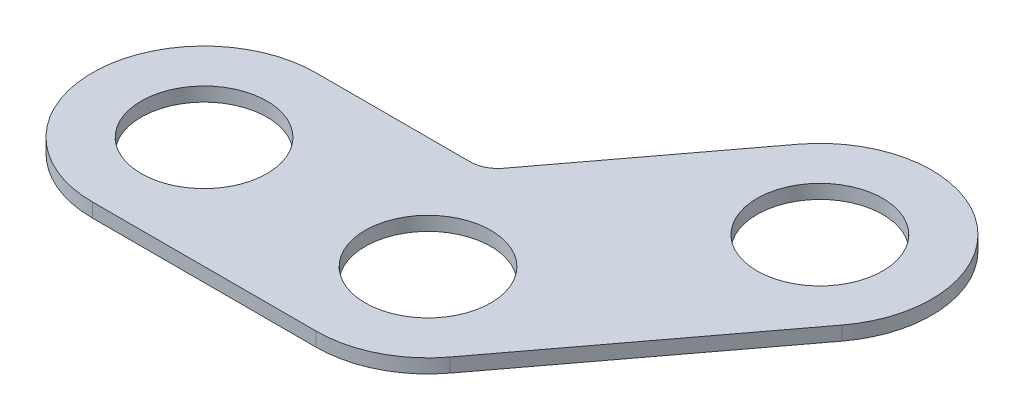
ISO-10303-21;
HEADER;
FILE_DESCRIPTION(('STEP AP214'),'2;1');
FILE_NAME('part.step','',(''),(''),'','','');
FILE_SCHEMA(('AUTOMOTIVE_DESIGN { 1 0 10303 214 1 1 1 1 }'));
ENDSEC;
DATA;
#1=APPLICATION_CONTEXT('core data for automotive mechanical design processes');
#2=APPLICATION_PROTOCOL_DEFINITION('international standard','automotive_design',2000,#1);
#3=PRODUCT_CONTEXT('',#1,'mechanical');
#4=PRODUCT('Part','Part','',(#3));
#5=PRODUCT_RELATED_PRODUCT_CATEGORY('part','',(#4));
#6=PRODUCT_DEFINITION_FORMATION('','',#4);
#7=PRODUCT_DEFINITION_CONTEXT('part definition',#1,'design');
#8=PRODUCT_DEFINITION('design','',#6,#7);
#9=PRODUCT_DEFINITION_SHAPE('','',#8);
#10=(LENGTH_UNIT() NAMED_UNIT(*) SI_UNIT(.MILLI.,.METRE.));
#11=(NAMED_UNIT(*) PLANE_ANGLE_UNIT() SI_UNIT($,.RADIAN.));
#12=(NAMED_UNIT(*) SI_UNIT($,.STERADIAN.) SOLID_ANGLE_UNIT());
#13=UNCERTAINTY_MEASURE_WITH_UNIT(LENGTH_MEASURE(1.E-05),#10,'distance_accuracy_value','');
#14=(GEOMETRIC_REPRESENTATION_CONTEXT(3) GLOBAL_UNCERTAINTY_ASSIGNED_CONTEXT((#13)) GLOBAL_UNIT_ASSIGNED_CONTEXT((#10,
#11,#12)) REPRESENTATION_CONTEXT('',''));
#15=CARTESIAN_POINT('',(0.,0.,0.));
#16=DIRECTION('',(0.,0.,1.));
#17=DIRECTION('',(1.,0.,0.));
#18=AXIS2_PLACEMENT_3D('',#15,#16,#17);
#19=CARTESIAN_POINT('',(52.7799348679045,3.175,39.7147931715671));
#20=DIRECTION('',(-0.799055461536221,0.,-0.601257323771724));
#21=DIRECTION('',(-0.601257323771724,0.,0.799055461536221));
#22=AXIS2_PLACEMENT_3D('',#19,#20,#21);
#23=PLANE('',#22);
#24=DIRECTION('',(0.601257323771724,0.,-0.799055461536221));
#25=VECTOR('',#24,1.);
#26=CARTESIAN_POINT('',(52.7799348679045,0.,39.7147931715671));
#27=LINE('',#26,#25);
#28=CARTESIAN_POINT('',(71.17220872302,0.,15.2719360238018));
#29=VERTEX_POINT('',#28);
#30=CARTESIAN_POINT('',(109.397864590596,0.,-35.5289738099173));
#31=VERTEX_POINT('',#30);
#32=EDGE_CURVE('E132',#29,#31,#27,.T.);
#33=ORIENTED_EDGE('',*,*,#32,.T.);
#34=DIRECTION('',(0.,-1.,0.));
#35=VECTOR('',#34,1.);
#36=CARTESIAN_POINT('',(109.397864590596,3.175,-35.5289738099173));
#37=LINE('',#36,#35);
#38=CARTESIAN_POINT('',(109.397864590596,3.175,-35.5289738099173));
#39=VERTEX_POINT('',#38);
#40=EDGE_CURVE('E112',#39,#31,#37,.T.);
#41=ORIENTED_EDGE('',*,*,#40,.F.);
#42=DIRECTION('',(0.601257323771724,0.,-0.799055461536221));
#43=VECTOR('',#42,1.);
#44=CARTESIAN_POINT('',(52.7799348679045,3.175,39.7147931715671));
#45=LINE('',#44,#43);
#46=CARTESIAN_POINT('',(71.17220872302,3.175,15.2719360238018));
#47=VERTEX_POINT('',#46);
#48=EDGE_CURVE('E119',#47,#39,#45,.T.);
#49=ORIENTED_EDGE('',*,*,#48,.F.);
#50=DIRECTION('',(0.,-1.,0.));
#51=VECTOR('',#50,1.);
#52=CARTESIAN_POINT('',(71.17220872302,3.175,15.2719360238018));
#53=LINE('',#52,#51);
#54=EDGE_CURVE('E156',#47,#29,#53,.T.);
#55=ORIENTED_EDGE('',*,*,#54,.T.);
#56=EDGE_LOOP('',(#33,#41,#49,#55));
#57=FACE_BOUND('',#56,.T.);
#58=ADVANCED_FACE('F42',(#57),#23,.F.);
#59=CARTESIAN_POINT('',(89.1018558675759,3.175,-50.8009098337191));
#60=DIRECTION('',(0.,-1.,0.));
#61=DIRECTION('',(0.,0.,-1.));
#62=AXIS2_PLACEMENT_3D('',#59,#60,#61);
#63=CYLINDRICAL_SURFACE('',#62,25.4);
#64=CARTESIAN_POINT('',(89.1018558675759,0.,-50.8009098337191));
#65=DIRECTION('',(0.,1.,0.));
#66=DIRECTION('',(0.,0.,1.));
#67=AXIS2_PLACEMENT_3D('',#64,#65,#66);
#68=CIRCLE('',#67,25.4);
#69=CARTESIAN_POINT('',(68.8058471445559,0.,-66.0728458575209));
#70=VERTEX_POINT('',#69);
#71=EDGE_CURVE('E175',#31,#70,#68,.T.);
#72=ORIENTED_EDGE('',*,*,#71,.T.);
#73=DIRECTION('',(0.,-1.,0.));
#74=VECTOR('',#73,1.);
#75=CARTESIAN_POINT('',(68.8058471445559,3.175,-66.0728458575209));
#76=LINE('',#75,#74);
#77=CARTESIAN_POINT('',(68.8058471445559,3.175,-66.0728458575209));
#78=VERTEX_POINT('',#77);
#79=EDGE_CURVE('E115',#78,#70,#76,.T.);
#80=ORIENTED_EDGE('',*,*,#79,.F.);
#81=CARTESIAN_POINT('',(89.1018558675759,3.175,-50.8009098337191));
#82=DIRECTION('',(0.,1.,0.));
#83=DIRECTION('',(0.,0.,1.));
#84=AXIS2_PLACEMENT_3D('',#81,#82,#83);
#85=CIRCLE('',#84,25.4);
#86=EDGE_CURVE('E107',#39,#78,#85,.T.);
#87=ORIENTED_EDGE('',*,*,#86,.F.);
#88=ORIENTED_EDGE('',*,*,#40,.T.);
#89=EDGE_LOOP('',(#72,#80,#87,#88));
#90=FACE_BOUND('',#89,.T.);
#91=ADVANCED_FACE('F110',(#90),#63,.T.);
#92=CARTESIAN_POINT('',(12.1879174218644,3.175,9.17092112396354));
#93=DIRECTION('',(-0.799055461536222,0.,-0.601257323771724));
#94=DIRECTION('',(-0.601257323771724,0.,0.799055461536222));
#95=AXIS2_PLACEMENT_3D('',#92,#93,#94);
#96=PLANE('',#95);
#97=DIRECTION('',(0.601257323771724,0.,-0.799055461536222));
#98=VECTOR('',#97,1.);
#99=CARTESIAN_POINT('',(12.1879174218644,0.,9.17092112396354));
#100=LINE('',#99,#98);
#101=CARTESIAN_POINT('',(40.1063958623448,0.,-27.9320159940496));
#102=VERTEX_POINT('',#101);
#103=EDGE_CURVE('E172',#102,#70,#100,.T.);
#104=ORIENTED_EDGE('',*,*,#103,.F.);
#105=DIRECTION('',(0.,-1.,0.));
#106=VECTOR('',#105,1.);
#107=CARTESIAN_POINT('',(40.1063958623448,3.175,-27.9320159940496));
#108=LINE('',#107,#106);
#109=CARTESIAN_POINT('',(40.1063958623448,3.175,-27.9320159940496));
#110=VERTEX_POINT('',#109);
#111=EDGE_CURVE('E58',#102,#110,#108,.F.);
#112=ORIENTED_EDGE('',*,*,#111,.T.);
#113=DIRECTION('',(0.601257323771724,0.,-0.799055461536222));
#114=VECTOR('',#113,1.);
#115=CARTESIAN_POINT('',(12.1879174218644,3.175,9.17092112396354));
#116=LINE('',#115,#114);
#117=EDGE_CURVE('E118',#110,#78,#116,.T.);
#118=ORIENTED_EDGE('',*,*,#117,.T.);
#119=ORIENTED_EDGE('',*,*,#79,.T.);
#120=EDGE_LOOP('',(#104,#112,#118,#119));
#121=FACE_BOUND('',#120,.T.);
#122=ADVANCED_FACE('F242',(#121),#96,.T.);
#123=CARTESIAN_POINT('',(0.,3.175,-25.4));
#124=DIRECTION('',(0.,0.,-1.));
#125=DIRECTION('',(-1.,0.,0.));
#126=AXIS2_PLACEMENT_3D('',#123,#124,#125);
#127=PLANE('',#126);
#128=DIRECTION('',(1.,0.,0.));
#129=VECTOR('',#128,1.);
#130=CARTESIAN_POINT('',(0.,3.175,-25.4));
#131=LINE('',#130,#129);
#132=CARTESIAN_POINT('',(0.,3.175,-25.4));
#133=VERTEX_POINT('',#132);
#134=CARTESIAN_POINT('',(35.0323936815898,3.175,-25.4));
#135=VERTEX_POINT('',#134);
#136=EDGE_CURVE('E200',#133,#135,#131,.T.);
#137=ORIENTED_EDGE('',*,*,#136,.T.);
#138=DIRECTION('',(0.,-1.,0.));
#139=VECTOR('',#138,1.);
#140=CARTESIAN_POINT('',(35.0323936815898,0.,-25.4));
#141=LINE('',#140,#139);
#142=CARTESIAN_POINT('',(35.0323936815898,0.,-25.4));
#143=VERTEX_POINT('',#142);
#144=EDGE_CURVE('E134',#135,#143,#141,.T.);
#145=ORIENTED_EDGE('',*,*,#144,.T.);
#146=DIRECTION('',(1.,0.,0.));
#147=VECTOR('',#146,1.);
#148=CARTESIAN_POINT('',(0.,0.,-25.4));
#149=LINE('',#148,#147);
#150=CARTESIAN_POINT('',(0.,0.,-25.4));
#151=VERTEX_POINT('',#150);
#152=EDGE_CURVE('E169',#151,#143,#149,.T.);
#153=ORIENTED_EDGE('',*,*,#152,.F.);
#154=DIRECTION('',(0.,-1.,0.));
#155=VECTOR('',#154,1.);
#156=CARTESIAN_POINT('',(0.,3.175,-25.4));
#157=LINE('',#156,#155);
#158=EDGE_CURVE('E140',#133,#151,#157,.T.);
#159=ORIENTED_EDGE('',*,*,#158,.F.);
#160=EDGE_LOOP('',(#137,#145,#153,#159));
#161=FACE_BOUND('',#160,.T.);
#162=ADVANCED_FACE('F249',(#161),#127,.T.);
#163=CARTESIAN_POINT('',(0.,3.175,0.));
#164=DIRECTION('',(0.,-1.,0.));
#165=DIRECTION('',(0.,0.,-1.));
#166=AXIS2_PLACEMENT_3D('',#163,#164,#165);
#167=CYLINDRICAL_SURFACE('',#166,25.4);
#168=CARTESIAN_POINT('',(0.,0.,0.));
#169=DIRECTION('',(0.,1.,0.));
#170=DIRECTION('',(0.,0.,1.));
#171=AXIS2_PLACEMENT_3D('',#168,#169,#170);
#172=CIRCLE('',#171,25.4);
#173=CARTESIAN_POINT('',(0.,0.,25.4));
#174=VERTEX_POINT('',#173);
#175=EDGE_CURVE('E166',#151,#174,#172,.T.);
#176=ORIENTED_EDGE('',*,*,#175,.T.);
#177=DIRECTION('',(0.,-1.,0.));
#178=VECTOR('',#177,1.);
#179=CARTESIAN_POINT('',(0.,3.175,25.4));
#180=LINE('',#179,#178);
#181=CARTESIAN_POINT('',(0.,3.175,25.4));
#182=VERTEX_POINT('',#181);
#183=EDGE_CURVE('E148',#182,#174,#180,.T.);
#184=ORIENTED_EDGE('',*,*,#183,.F.);
#185=CARTESIAN_POINT('',(0.,3.175,0.));
#186=DIRECTION('',(0.,1.,0.));
#187=DIRECTION('',(0.,0.,1.));
#188=AXIS2_PLACEMENT_3D('',#185,#186,#187);
#189=CIRCLE('',#188,25.4);
#190=EDGE_CURVE('E197',#133,#182,#189,.T.);
#191=ORIENTED_EDGE('',*,*,#190,.F.);
#192=ORIENTED_EDGE('',*,*,#158,.T.);
#193=EDGE_LOOP('',(#176,#184,#191,#192));
#194=FACE_BOUND('',#193,.T.);
#195=ADVANCED_FACE('F253',(#194),#167,.T.);
#196=CARTESIAN_POINT('',(0.,3.175,25.4));
#197=DIRECTION('',(0.,0.,-1.));
#198=DIRECTION('',(-1.,0.,0.));
#199=AXIS2_PLACEMENT_3D('',#196,#197,#198);
#200=PLANE('',#199);
#201=DIRECTION('',(1.,0.,0.));
#202=VECTOR('',#201,1.);
#203=CARTESIAN_POINT('',(0.,0.,25.4));
#204=LINE('',#203,#202);
#205=CARTESIAN_POINT('',(50.8762,0.,25.4));
#206=VERTEX_POINT('',#205);
#207=EDGE_CURVE('E163',#174,#206,#204,.T.);
#208=ORIENTED_EDGE('',*,*,#207,.T.);
#209=DIRECTION('',(0.,-1.,0.));
#210=VECTOR('',#209,1.);
#211=CARTESIAN_POINT('',(50.8762,3.175,25.4));
#212=LINE('',#211,#210);
#213=CARTESIAN_POINT('',(50.8762,3.175,25.4));
#214=VERTEX_POINT('',#213);
#215=EDGE_CURVE('E152',#214,#206,#212,.T.);
#216=ORIENTED_EDGE('',*,*,#215,.F.);
#217=DIRECTION('',(1.,0.,0.));
#218=VECTOR('',#217,1.);
#219=CARTESIAN_POINT('',(0.,3.175,25.4));
#220=LINE('',#219,#218);
#221=EDGE_CURVE('E194',#182,#214,#220,.T.);
#222=ORIENTED_EDGE('',*,*,#221,.F.);
#223=ORIENTED_EDGE('',*,*,#183,.T.);
#224=EDGE_LOOP('',(#208,#216,#222,#223));
#225=FACE_BOUND('',#224,.T.);
#226=ADVANCED_FACE('F233',(#225),#200,.F.);
#227=CARTESIAN_POINT('',(0.,3.175,0.));
#228=DIRECTION('',(0.,-1.,0.));
#229=DIRECTION('',(0.,0.,-1.));
#230=AXIS2_PLACEMENT_3D('',#227,#228,#229);
#231=CYLINDRICAL_SURFACE('',#230,14.2875);
#232=CARTESIAN_POINT('',(0.,3.175,0.));
#233=DIRECTION('',(0.,1.,0.));
#234=DIRECTION('',(0.,0.,1.));
#235=AXIS2_PLACEMENT_3D('',#232,#233,#234);
#236=CIRCLE('',#235,14.2875);
#237=CARTESIAN_POINT('',(0.,3.175,14.2875));
#238=VERTEX_POINT('',#237);
#239=EDGE_CURVE('E129',#238,#238,#236,.T.);
#240=ORIENTED_EDGE('',*,*,#239,.T.);
#241=EDGE_LOOP('',(#240));
#242=FACE_BOUND('',#241,.T.);
#243=CARTESIAN_POINT('',(0.,0.,0.));
#244=DIRECTION('',(0.,1.,0.));
#245=DIRECTION('',(0.,0.,1.));
#246=AXIS2_PLACEMENT_3D('',#243,#244,#245);
#247=CIRCLE('',#246,14.2875);
#248=CARTESIAN_POINT('',(0.,0.,14.2875));
#249=VERTEX_POINT('',#248);
#250=EDGE_CURVE('E180',#249,#249,#247,.T.);
#251=ORIENTED_EDGE('',*,*,#250,.F.);
#252=EDGE_LOOP('',(#251));
#253=FACE_BOUND('',#252,.T.);
#254=ADVANCED_FACE('F229',(#242,#253),#231,.F.);
#255=CARTESIAN_POINT('',(50.8762,3.175,0.));
#256=DIRECTION('',(0.,-1.,0.));
#257=DIRECTION('',(0.,0.,-1.));
#258=AXIS2_PLACEMENT_3D('',#255,#256,#257);
#259=CYLINDRICAL_SURFACE('',#258,14.2875);
#260=CARTESIAN_POINT('',(50.8762,3.175,0.));
#261=DIRECTION('',(0.,1.,0.));
#262=DIRECTION('',(0.,0.,1.));
#263=AXIS2_PLACEMENT_3D('',#260,#261,#262);
#264=CIRCLE('',#263,14.2875);
#265=CARTESIAN_POINT('',(50.8762,3.175,14.2875));
#266=VERTEX_POINT('',#265);
#267=EDGE_CURVE('E209',#266,#266,#264,.T.);
#268=ORIENTED_EDGE('',*,*,#267,.T.);
#269=EDGE_LOOP('',(#268));
#270=FACE_BOUND('',#269,.T.);
#271=CARTESIAN_POINT('',(50.8762,0.,0.));
#272=DIRECTION('',(0.,1.,0.));
#273=DIRECTION('',(0.,0.,1.));
#274=AXIS2_PLACEMENT_3D('',#271,#272,#273);
#275=CIRCLE('',#274,14.2875);
#276=CARTESIAN_POINT('',(50.8762,0.,14.2875));
#277=VERTEX_POINT('',#276);
#278=EDGE_CURVE('E184',#277,#277,#275,.T.);
#279=ORIENTED_EDGE('',*,*,#278,.F.);
#280=EDGE_LOOP('',(#279));
#281=FACE_BOUND('',#280,.T.);
#282=ADVANCED_FACE('F232',(#270,#281),#259,.F.);
#283=CARTESIAN_POINT('',(89.1018558675759,3.175,-50.8009098337191));
#284=DIRECTION('',(0.,-1.,0.));
#285=DIRECTION('',(0.,0.,-1.));
#286=AXIS2_PLACEMENT_3D('',#283,#284,#285);
#287=CYLINDRICAL_SURFACE('',#286,14.2875);
#288=CARTESIAN_POINT('',(89.1018558675759,3.175,-50.8009098337191));
#289=DIRECTION('',(0.,1.,0.));
#290=DIRECTION('',(0.,0.,1.));
#291=AXIS2_PLACEMENT_3D('',#288,#289,#290);
#292=CIRCLE('',#291,14.2875);
#293=CARTESIAN_POINT('',(89.1018558675759,3.175,-36.5134098337192));
#294=VERTEX_POINT('',#293);
#295=EDGE_CURVE('E162',#294,#294,#292,.T.);
#296=ORIENTED_EDGE('',*,*,#295,.T.);
#297=EDGE_LOOP('',(#296));
#298=FACE_BOUND('',#297,.T.);
#299=CARTESIAN_POINT('',(89.1018558675759,0.,-50.8009098337191));
#300=DIRECTION('',(0.,1.,0.));
#301=DIRECTION('',(0.,0.,1.));
#302=AXIS2_PLACEMENT_3D('',#299,#300,#301);
#303=CIRCLE('',#302,14.2875);
#304=CARTESIAN_POINT('',(89.1018558675759,0.,-36.5134098337192));
#305=VERTEX_POINT('',#304);
#306=EDGE_CURVE('E188',#305,#305,#303,.T.);
#307=ORIENTED_EDGE('',*,*,#306,.F.);
#308=EDGE_LOOP('',(#307));
#309=FACE_BOUND('',#308,.T.);
#310=ADVANCED_FACE('F217',(#298,#309),#287,.F.);
#311=CARTESIAN_POINT('',(50.8762,3.175,0.));
#312=DIRECTION('',(0.,-1.,0.));
#313=DIRECTION('',(0.,0.,-1.));
#314=AXIS2_PLACEMENT_3D('',#311,#312,#313);
#315=CYLINDRICAL_SURFACE('',#314,25.4);
#316=CARTESIAN_POINT('',(50.8762,0.,0.));
#317=DIRECTION('',(0.,1.,0.));
#318=DIRECTION('',(0.,0.,1.));
#319=AXIS2_PLACEMENT_3D('',#316,#317,#318);
#320=CIRCLE('',#319,25.4);
#321=EDGE_CURVE('E159',#206,#29,#320,.T.);
#322=ORIENTED_EDGE('',*,*,#321,.T.);
#323=ORIENTED_EDGE('',*,*,#54,.F.);
#324=CARTESIAN_POINT('',(50.8762,3.175,0.));
#325=DIRECTION('',(0.,1.,0.));
#326=DIRECTION('',(0.,0.,1.));
#327=AXIS2_PLACEMENT_3D('',#324,#325,#326);
#328=CIRCLE('',#327,25.4);
#329=EDGE_CURVE('E124',#214,#47,#328,.T.);
#330=ORIENTED_EDGE('',*,*,#329,.F.);
#331=ORIENTED_EDGE('',*,*,#215,.T.);
#332=EDGE_LOOP('',(#322,#323,#330,#331));
#333=FACE_BOUND('',#332,.T.);
#334=ADVANCED_FACE('F223',(#333),#315,.T.);
#335=CARTESIAN_POINT('',(0.,3.175,0.));
#336=DIRECTION('',(0.,1.,0.));
#337=DIRECTION('',(0.,0.,1.));
#338=AXIS2_PLACEMENT_3D('',#335,#336,#337);
#339=PLANE('',#338);
#340=ORIENTED_EDGE('',*,*,#295,.F.);
#341=EDGE_LOOP('',(#340));
#342=FACE_BOUND('',#341,.T.);
#343=ORIENTED_EDGE('',*,*,#267,.F.);
#344=EDGE_LOOP('',(#343));
#345=FACE_BOUND('',#344,.T.);
#346=ORIENTED_EDGE('',*,*,#239,.F.);
#347=EDGE_LOOP('',(#346));
#348=FACE_BOUND('',#347,.T.);
#349=ORIENTED_EDGE('',*,*,#48,.T.);
#350=ORIENTED_EDGE('',*,*,#86,.T.);
#351=ORIENTED_EDGE('',*,*,#117,.F.);
#352=CARTESIAN_POINT('',(35.0323936815898,3.175,-31.75));
#353=DIRECTION('',(0.,1.,0.));
#354=DIRECTION('',(0.,0.,1.));
#355=AXIS2_PLACEMENT_3D('',#352,#353,#354);
#356=CIRCLE('',#355,6.35);
#357=EDGE_CURVE('E11',#110,#135,#356,.F.);
#358=ORIENTED_EDGE('',*,*,#357,.T.);
#359=ORIENTED_EDGE('',*,*,#136,.F.);
#360=ORIENTED_EDGE('',*,*,#190,.T.);
#361=ORIENTED_EDGE('',*,*,#221,.T.);
#362=ORIENTED_EDGE('',*,*,#329,.T.);
#363=EDGE_LOOP('',(#349,#350,#351,#358,#359,#360,#361,#362));
#364=FACE_BOUND('',#363,.T.);
#365=ADVANCED_FACE('F122',(#342,#345,#348,#364),#339,.T.);
#366=CARTESIAN_POINT('',(0.,0.,0.));
#367=DIRECTION('',(0.,1.,0.));
#368=DIRECTION('',(0.,0.,1.));
#369=AXIS2_PLACEMENT_3D('',#366,#367,#368);
#370=PLANE('',#369);
#371=ORIENTED_EDGE('',*,*,#306,.T.);
#372=EDGE_LOOP('',(#371));
#373=FACE_BOUND('',#372,.T.);
#374=ORIENTED_EDGE('',*,*,#278,.T.);
#375=EDGE_LOOP('',(#374));
#376=FACE_BOUND('',#375,.T.);
#377=ORIENTED_EDGE('',*,*,#250,.T.);
#378=EDGE_LOOP('',(#377));
#379=FACE_BOUND('',#378,.T.);
#380=ORIENTED_EDGE('',*,*,#32,.F.);
#381=ORIENTED_EDGE('',*,*,#321,.F.);
#382=ORIENTED_EDGE('',*,*,#207,.F.);
#383=ORIENTED_EDGE('',*,*,#175,.F.);
#384=ORIENTED_EDGE('',*,*,#152,.T.);
#385=CARTESIAN_POINT('',(35.0323936815898,0.,-31.75));
#386=DIRECTION('',(0.,1.,0.));
#387=DIRECTION('',(0.,0.,1.));
#388=AXIS2_PLACEMENT_3D('',#385,#386,#387);
#389=CIRCLE('',#388,6.35);
#390=EDGE_CURVE('E51',#143,#102,#389,.T.);
#391=ORIENTED_EDGE('',*,*,#390,.T.);
#392=ORIENTED_EDGE('',*,*,#103,.T.);
#393=ORIENTED_EDGE('',*,*,#71,.F.);
#394=EDGE_LOOP('',(#380,#381,#382,#383,#384,#391,#392,#393));
#395=FACE_BOUND('',#394,.T.);
#396=ADVANCED_FACE('F222',(#373,#376,#379,#395),#370,.F.);
#397=CARTESIAN_POINT('',(35.0323936815898,3.175,-31.75));
#398=DIRECTION('',(0.,1.,0.));
#399=DIRECTION('',(0.,0.,1.));
#400=AXIS2_PLACEMENT_3D('',#397,#398,#399);
#401=CYLINDRICAL_SURFACE('',#400,6.35);
#402=ORIENTED_EDGE('',*,*,#357,.F.);
#403=ORIENTED_EDGE('',*,*,#111,.F.);
#404=ORIENTED_EDGE('',*,*,#390,.F.);
#405=ORIENTED_EDGE('',*,*,#144,.F.);
#406=EDGE_LOOP('',(#402,#403,#404,#405));
#407=FACE_BOUND('',#406,.T.);
#408=ADVANCED_FACE('F44',(#407),#401,.F.);
#409=CLOSED_SHELL('',(#58,#91,#122,#162,#195,#226,#254,#282,#310,#334,#365,#396,#408));
#410=MANIFOLD_SOLID_BREP('B2',#409);
#411=ADVANCED_BREP_SHAPE_REPRESENTATION('',(#18,#410),#14);
#412=SHAPE_DEFINITION_REPRESENTATION(#9,#411);
ENDSEC;
END-ISO-10303-21;
